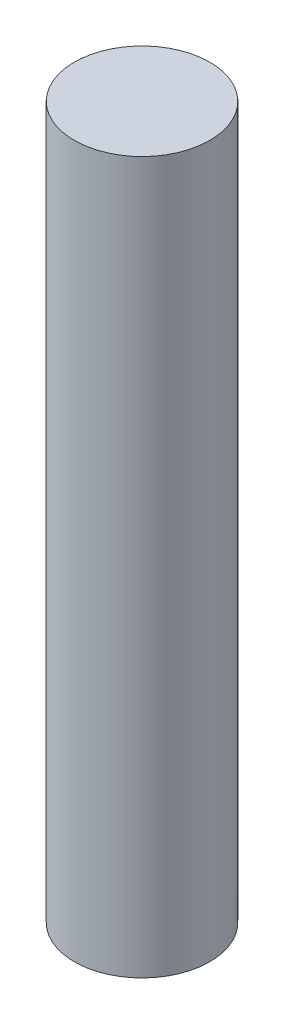
ISO-10303-21;
HEADER;
FILE_DESCRIPTION(('STEP AP214'),'2;1');
FILE_NAME('part.step','',(''),(''),'','','');
FILE_SCHEMA(('AUTOMOTIVE_DESIGN { 1 0 10303 214 1 1 1 1 }'));
ENDSEC;
DATA;
#1=APPLICATION_CONTEXT('core data for automotive mechanical design processes');
#2=APPLICATION_PROTOCOL_DEFINITION('international standard','automotive_design',2000,#1);
#3=PRODUCT_CONTEXT('',#1,'mechanical');
#4=PRODUCT('Part','Part','',(#3));
#5=PRODUCT_RELATED_PRODUCT_CATEGORY('part','',(#4));
#6=PRODUCT_DEFINITION_FORMATION('','',#4);
#7=PRODUCT_DEFINITION_CONTEXT('part definition',#1,'design');
#8=PRODUCT_DEFINITION('design','',#6,#7);
#9=PRODUCT_DEFINITION_SHAPE('','',#8);
#10=(LENGTH_UNIT() NAMED_UNIT(*) SI_UNIT(.MILLI.,.METRE.));
#11=(NAMED_UNIT(*) PLANE_ANGLE_UNIT() SI_UNIT($,.RADIAN.));
#12=(NAMED_UNIT(*) SI_UNIT($,.STERADIAN.) SOLID_ANGLE_UNIT());
#13=UNCERTAINTY_MEASURE_WITH_UNIT(LENGTH_MEASURE(1.E-05),#10,'distance_accuracy_value','');
#14=(GEOMETRIC_REPRESENTATION_CONTEXT(3) GLOBAL_UNCERTAINTY_ASSIGNED_CONTEXT((#13)) GLOBAL_UNIT_ASSIGNED_CONTEXT((#10,
#11,#12)) REPRESENTATION_CONTEXT('',''));
#15=CARTESIAN_POINT('',(0.,0.,0.));
#16=DIRECTION('',(0.,0.,1.));
#17=DIRECTION('',(1.,0.,0.));
#18=AXIS2_PLACEMENT_3D('',#15,#16,#17);
#19=CARTESIAN_POINT('',(0.,21.,0.));
#20=DIRECTION('',(0.,-1.,0.));
#21=DIRECTION('',(0.,0.,-1.));
#22=AXIS2_PLACEMENT_3D('',#19,#20,#21);
#23=CYLINDRICAL_SURFACE('',#22,2.);
#24=CARTESIAN_POINT('',(0.,21.,0.));
#25=DIRECTION('',(0.,1.,0.));
#26=DIRECTION('',(0.,0.,1.));
#27=AXIS2_PLACEMENT_3D('',#24,#25,#26);
#28=CIRCLE('',#27,2.);
#29=CARTESIAN_POINT('',(0.,21.,-2.));
#30=VERTEX_POINT('',#29);
#31=EDGE_CURVE('E10',#30,#30,#28,.T.);
#32=CARTESIAN_POINT('',(0.,0.,0.));
#33=DIRECTION('',(0.,1.,0.));
#34=DIRECTION('',(0.,0.,1.));
#35=AXIS2_PLACEMENT_3D('',#32,#33,#34);
#36=CIRCLE('',#35,2.);
#37=CARTESIAN_POINT('',(0.,0.,-2.));
#38=VERTEX_POINT('',#37);
#39=EDGE_CURVE('E35',#38,#38,#36,.T.);
#40=CARTESIAN_POINT('',(0.,21.,-2.));
#41=CARTESIAN_POINT('',(0.,20.78125,-2.));
#42=CARTESIAN_POINT('',(0.,20.5625,-2.));
#43=CARTESIAN_POINT('',(0.,20.125,-2.));
#44=CARTESIAN_POINT('',(0.,19.90625,-2.));
#45=CARTESIAN_POINT('',(0.,19.46875,-2.));
#46=CARTESIAN_POINT('',(0.,19.25,-2.));
#47=CARTESIAN_POINT('',(0.,18.8125,-2.));
#48=CARTESIAN_POINT('',(0.,18.59375,-2.));
#49=CARTESIAN_POINT('',(0.,18.15625,-2.));
#50=CARTESIAN_POINT('',(0.,17.9375,-2.));
#51=CARTESIAN_POINT('',(0.,17.5,-2.));
#52=CARTESIAN_POINT('',(0.,17.28125,-2.));
#53=CARTESIAN_POINT('',(0.,16.84375,-2.));
#54=CARTESIAN_POINT('',(0.,16.625,-2.));
#55=CARTESIAN_POINT('',(0.,16.1875,-2.));
#56=CARTESIAN_POINT('',(0.,15.96875,-2.));
#57=CARTESIAN_POINT('',(0.,15.53125,-2.));
#58=CARTESIAN_POINT('',(0.,15.3125,-2.));
#59=CARTESIAN_POINT('',(0.,14.875,-2.));
#60=CARTESIAN_POINT('',(0.,14.65625,-2.));
#61=CARTESIAN_POINT('',(0.,14.21875,-2.));
#62=CARTESIAN_POINT('',(0.,14.,-2.));
#63=CARTESIAN_POINT('',(0.,13.5625,-2.));
#64=CARTESIAN_POINT('',(0.,13.34375,-2.));
#65=CARTESIAN_POINT('',(0.,12.90625,-2.));
#66=CARTESIAN_POINT('',(0.,12.6875,-2.));
#67=CARTESIAN_POINT('',(0.,12.25,-2.));
#68=CARTESIAN_POINT('',(0.,12.03125,-2.));
#69=CARTESIAN_POINT('',(0.,11.59375,-2.));
#70=CARTESIAN_POINT('',(0.,11.375,-2.));
#71=CARTESIAN_POINT('',(0.,10.9375,-2.));
#72=CARTESIAN_POINT('',(0.,10.71875,-2.));
#73=CARTESIAN_POINT('',(0.,10.28125,-2.));
#74=CARTESIAN_POINT('',(0.,10.0625,-2.));
#75=CARTESIAN_POINT('',(0.,9.625,-2.));
#76=CARTESIAN_POINT('',(0.,9.40625,-2.));
#77=CARTESIAN_POINT('',(0.,8.96875,-2.));
#78=CARTESIAN_POINT('',(0.,8.75,-2.));
#79=CARTESIAN_POINT('',(0.,8.3125,-2.));
#80=CARTESIAN_POINT('',(0.,8.09375,-2.));
#81=CARTESIAN_POINT('',(0.,7.65625,-2.));
#82=CARTESIAN_POINT('',(0.,7.4375,-2.));
#83=CARTESIAN_POINT('',(0.,7.,-2.));
#84=CARTESIAN_POINT('',(0.,6.78125,-2.));
#85=CARTESIAN_POINT('',(0.,6.34375,-2.));
#86=CARTESIAN_POINT('',(0.,6.125,-2.));
#87=CARTESIAN_POINT('',(0.,5.6875,-2.));
#88=CARTESIAN_POINT('',(0.,5.46875,-2.));
#89=CARTESIAN_POINT('',(0.,5.03125,-2.));
#90=CARTESIAN_POINT('',(0.,4.8125,-2.));
#91=CARTESIAN_POINT('',(0.,4.375,-2.));
#92=CARTESIAN_POINT('',(0.,4.15625,-2.));
#93=CARTESIAN_POINT('',(0.,3.71875,-2.));
#94=CARTESIAN_POINT('',(0.,3.5,-2.));
#95=CARTESIAN_POINT('',(0.,3.0625,-2.));
#96=CARTESIAN_POINT('',(0.,2.84375,-2.));
#97=CARTESIAN_POINT('',(0.,2.40625,-2.));
#98=CARTESIAN_POINT('',(0.,2.1875,-2.));
#99=CARTESIAN_POINT('',(0.,1.75,-2.));
#100=CARTESIAN_POINT('',(0.,1.53125,-2.));
#101=CARTESIAN_POINT('',(0.,1.09375,-2.));
#102=CARTESIAN_POINT('',(0.,0.875000000000001,-2.));
#103=CARTESIAN_POINT('',(0.,0.4375,-2.));
#104=CARTESIAN_POINT('',(0.,0.21875,-2.));
#105=CARTESIAN_POINT('',(0.,0.,-2.));
#106=B_SPLINE_CURVE_WITH_KNOTS('',3,(#40,#41,#42,#43,#44,#45,#46,#47,#48,#49,#50,#51,#52,#53,
#54,#55,#56,#57,#58,#59,#60,#61,#62,#63,#64,#65,#66,#67,#68,#69,#70,#71,#72,#73,#74,#75,#76,#77,
#78,#79,#80,#81,#82,#83,#84,#85,#86,#87,#88,#89,#90,#91,#92,#93,#94,#95,#96,#97,#98,#99,#100,
#101,#102,#103,#104,#105),.UNSPECIFIED.,.F.,.F.,(4,2,2,2,2,2,2,2,2,2,2,2,2,2,2,2,2,2,2,2,2,2,2,
2,2,2,2,2,2,2,2,2,4),(0.,0.656250000000001,1.3125,1.96875,2.625,3.28125,3.9375,4.59375,5.25,
5.90625,6.5625,7.21875,7.875,8.53125,9.1875,9.84375,10.5,11.15625,11.8125,12.46875,13.125,
13.78125,14.4375,15.09375,15.75,16.40625,17.0625,17.71875,18.375,19.03125,19.6875,20.34375,21.),.UNSPECIFIED.);
#107=EDGE_CURVE('BSEAM32',#30,#38,#106,.T.);
#108=ORIENTED_EDGE('',*,*,#31,.F.);
#109=ORIENTED_EDGE('',*,*,#39,.T.);
#110=ORIENTED_EDGE('',*,*,#107,.T.);
#111=ORIENTED_EDGE('',*,*,#107,.F.);
#112=EDGE_LOOP('',(#108,#110,#109,#111));
#113=FACE_BOUND('',#112,.T.);
#114=ADVANCED_FACE('F32',(#113),#23,.T.);
#115=CARTESIAN_POINT('',(0.,21.,0.));
#116=DIRECTION('',(0.,1.,0.));
#117=DIRECTION('',(0.,0.,1.));
#118=AXIS2_PLACEMENT_3D('',#115,#116,#117);
#119=PLANE('',#118);
#120=ORIENTED_EDGE('',*,*,#31,.T.);
#121=EDGE_LOOP('',(#120));
#122=FACE_BOUND('',#121,.T.);
#123=ADVANCED_FACE('F47',(#122),#119,.T.);
#124=CARTESIAN_POINT('',(0.,0.,0.));
#125=DIRECTION('',(0.,1.,0.));
#126=DIRECTION('',(0.,0.,1.));
#127=AXIS2_PLACEMENT_3D('',#124,#125,#126);
#128=PLANE('',#127);
#129=ORIENTED_EDGE('',*,*,#39,.F.);
#130=EDGE_LOOP('',(#129));
#131=FACE_BOUND('',#130,.T.);
#132=ADVANCED_FACE('F45',(#131),#128,.F.);
#133=CLOSED_SHELL('',(#114,#123,#132));
#134=MANIFOLD_SOLID_BREP('B2',#133);
#135=ADVANCED_BREP_SHAPE_REPRESENTATION('',(#18,#134),#14);
#136=SHAPE_DEFINITION_REPRESENTATION(#9,#135);
ENDSEC;
END-ISO-10303-21;
